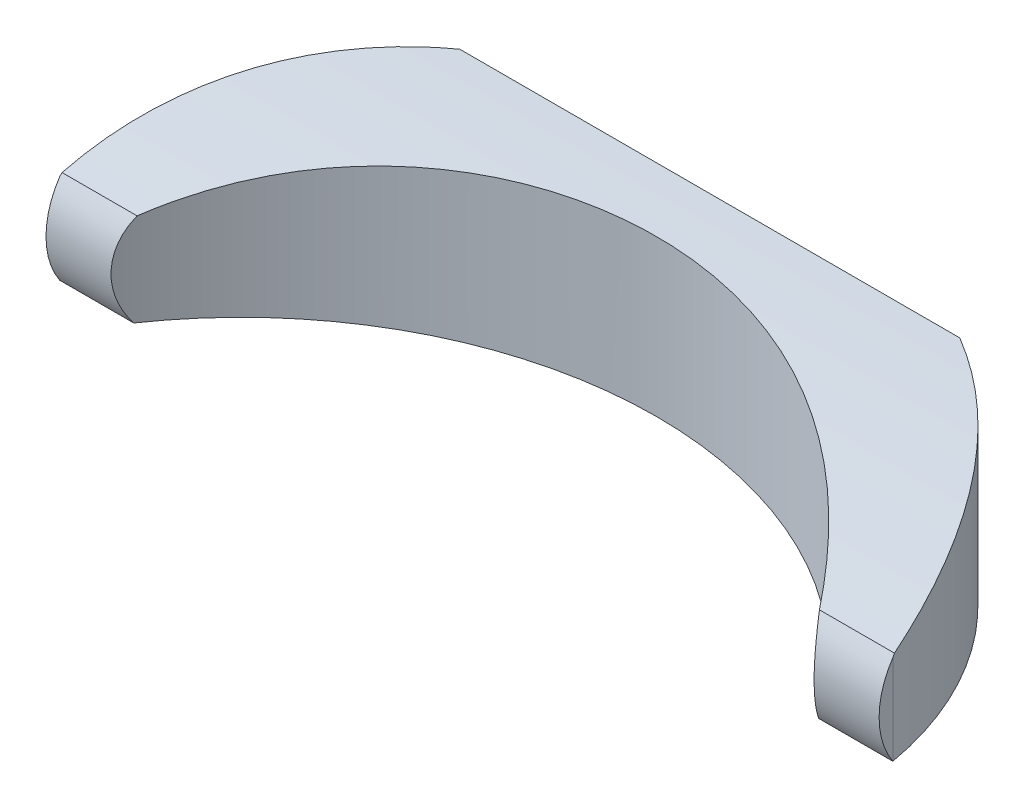
ISO-10303-21;
HEADER;
FILE_DESCRIPTION(('STEP AP214'),'2;1');
FILE_NAME('part.step','',(''),(''),'','','');
FILE_SCHEMA(('AUTOMOTIVE_DESIGN { 1 0 10303 214 1 1 1 1 }'));
ENDSEC;
DATA;
#1=APPLICATION_CONTEXT('core data for automotive mechanical design processes');
#2=APPLICATION_PROTOCOL_DEFINITION('international standard','automotive_design',2000,#1);
#3=PRODUCT_CONTEXT('',#1,'mechanical');
#4=PRODUCT('Part','Part','',(#3));
#5=PRODUCT_RELATED_PRODUCT_CATEGORY('part','',(#4));
#6=PRODUCT_DEFINITION_FORMATION('','',#4);
#7=PRODUCT_DEFINITION_CONTEXT('part definition',#1,'design');
#8=PRODUCT_DEFINITION('design','',#6,#7);
#9=PRODUCT_DEFINITION_SHAPE('','',#8);
#10=(LENGTH_UNIT() NAMED_UNIT(*) SI_UNIT(.MILLI.,.METRE.));
#11=(NAMED_UNIT(*) PLANE_ANGLE_UNIT() SI_UNIT($,.RADIAN.));
#12=(NAMED_UNIT(*) SI_UNIT($,.STERADIAN.) SOLID_ANGLE_UNIT());
#13=UNCERTAINTY_MEASURE_WITH_UNIT(LENGTH_MEASURE(1.E-05),#10,'distance_accuracy_value','');
#14=(GEOMETRIC_REPRESENTATION_CONTEXT(3) GLOBAL_UNCERTAINTY_ASSIGNED_CONTEXT((#13)) GLOBAL_UNIT_ASSIGNED_CONTEXT((#10,
#11,#12)) REPRESENTATION_CONTEXT('',''));
#15=CARTESIAN_POINT('',(0.,0.,0.));
#16=DIRECTION('',(0.,0.,1.));
#17=DIRECTION('',(1.,0.,0.));
#18=AXIS2_PLACEMENT_3D('',#15,#16,#17);
#19=CARTESIAN_POINT('',(386.358792184725,-406.025924914336,-173.707871951908));
#20=DIRECTION('',(-1.,0.,0.));
#21=DIRECTION('',(0.,0.,1.));
#22=AXIS2_PLACEMENT_3D('',#19,#20,#21);
#23=CYLINDRICAL_SURFACE('',#22,513.171988106752);
#24=CARTESIAN_POINT('',(-153.430774948807,55.5187782247357,50.6177315393173));
#25=CARTESIAN_POINT('',(-153.202685554566,56.1255648725674,49.369285670067));
#26=CARTESIAN_POINT('',(-152.962205663936,56.7263777072998,48.1202387606617));
#27=CARTESIAN_POINT('',(-152.45623692469,57.9159375243489,45.621451765565));
#28=CARTESIAN_POINT('',(-152.19074785455,58.5046843997328,44.3717116738312));
#29=CARTESIAN_POINT('',(-151.356424862871,60.2526462806282,40.6222192270144));
#30=CARTESIAN_POINT('',(-150.749740436409,61.3935684706254,38.122223661776));
#31=CARTESIAN_POINT('',(-149.433841216174,63.625818860735,33.1259238781543));
#32=CARTESIAN_POINT('',(-148.724587093074,64.7171278252159,30.6296214484789));
#33=CARTESIAN_POINT('',(-147.202623165766,66.848824241534,25.6468459372209));
#34=CARTESIAN_POINT('',(-146.389915432288,67.88921271202,23.1603726599245));
#35=CARTESIAN_POINT('',(-144.660470417526,69.9181965800934,18.2031850619156));
#36=CARTESIAN_POINT('',(-143.74375533913,70.9068029662032,15.7324674962666));
#37=CARTESIAN_POINT('',(-141.805767670981,72.8320365547571,10.8118341426195));
#38=CARTESIAN_POINT('',(-140.784494488364,73.7686634624216,8.36191847265735));
#39=CARTESIAN_POINT('',(-138.637577368679,75.5895981772944,3.48902836487891));
#40=CARTESIAN_POINT('',(-137.511950354785,76.4739144298083,1.06604962979815));
#41=CARTESIAN_POINT('',(-135.156598469928,78.19046227434,-3.74755550685225));
#42=CARTESIAN_POINT('',(-133.926873752021,79.022693942935,-6.13818195598368));
#43=CARTESIAN_POINT('',(-131.359970475643,80.6380331796544,-10.8889644273483));
#44=CARTESIAN_POINT('',(-130.022455071364,81.4209719696027,-13.2489958875063));
#45=CARTESIAN_POINT('',(-127.244706742592,82.9353630257782,-17.9247297481069));
#46=CARTESIAN_POINT('',(-125.804473584862,83.6668151750897,-20.2404320478784));
#47=CARTESIAN_POINT('',(-122.822763796423,85.0791715326357,-24.8219401937265));
#48=CARTESIAN_POINT('',(-121.281275442945,85.7600698685195,-27.0877402217015));
#49=CARTESIAN_POINT('',(-118.099248359522,87.0723275775556,-31.5634335219186));
#50=CARTESIAN_POINT('',(-116.458710068566,87.7036871702351,-33.7733270418767));
#51=CARTESIAN_POINT('',(-113.083062804686,88.9174594544886,-38.1289623793111));
#52=CARTESIAN_POINT('',(-111.348072730826,89.4999314413004,-40.2747798166903));
#53=CARTESIAN_POINT('',(-107.784403004586,90.6183425143344,-44.4997582956727));
#54=CARTESIAN_POINT('',(-105.955721933083,91.1542808953875,-46.5789183268503));
#55=CARTESIAN_POINT('',(-102.208130956909,92.1812346052886,-50.664983725556));
#56=CARTESIAN_POINT('',(-100.289240065002,92.6722593365148,-52.6719041623717));
#57=CARTESIAN_POINT('',(-96.3644130067902,93.6113523463592,-56.6088700325889));
#58=CARTESIAN_POINT('',(-94.3584818614818,94.0594230980441,-58.5389198880542));
#59=CARTESIAN_POINT('',(-89.3963995129003,95.0956175784906,-63.1172367247203));
#60=CARTESIAN_POINT('',(-86.3972843595752,95.6627917013153,-65.7238943270171));
#61=CARTESIAN_POINT('',(-80.241348704182,96.720276917279,-70.7595094454342));
#62=CARTESIAN_POINT('',(-77.0845580248454,97.2106024734969,-73.1885003528368));
#63=CARTESIAN_POINT('',(-72.2396274009154,97.8933088807836,-76.6908081014092));
#64=CARTESIAN_POINT('',(-70.6059390770932,98.1121286282471,-77.8349816914073));
#65=CARTESIAN_POINT('',(-67.3035219499349,98.532954397518,-80.0749439381422));
#66=CARTESIAN_POINT('',(-65.6347932163995,98.7349604528144,-81.1707326912486));
#67=CARTESIAN_POINT('',(-62.263659560825,99.1229745430345,-83.3128269774774));
#68=CARTESIAN_POINT('',(-60.5612488370298,99.3089797917691,-84.3591238784601));
#69=CARTESIAN_POINT('',(-57.1246536410795,99.6657354095095,-86.4009031251981));
#70=CARTESIAN_POINT('',(-55.3904691803689,99.8364857840099,-87.3963854892557));
#71=CARTESIAN_POINT('',(-53.6412078152752,99.9999999999999,-88.3658969804619));
#72=B_SPLINE_CURVE_WITH_KNOTS('',3,(#24,#25,#26,#27,#28,#29,#30,#31,#32,#33,#34,#35,#36,#37,#38,
#39,#40,#41,#42,#43,#44,#45,#46,#47,#48,#49,#50,#51,#52,#53,#54,#55,#56,#57,#58,#59,#60,#61,#62,
#63,#64,#65,#66,#67,#68,#69,#70,#71),.UNSPECIFIED.,.F.,.F.,(4,2,2,2,2,2,2,2,2,2,2,2,2,2,2,2,2,2,
2,2,2,2,2,4),(0.,4.21998996795097,8.44001731873224,16.8801698341858,25.3235672652203,
33.7667957196065,42.2082251416448,50.649702430777,59.0898131431199,67.5299114461289,
75.9974918188728,84.4650914191382,92.9336730851469,101.402217221147,109.860336875911,
118.318584682425,126.775057738179,135.231043621433,147.264589414661,159.295867740009,
165.31450647585,171.333133223636,177.352805870687,183.372476349559),.UNSPECIFIED.);
#73=CARTESIAN_POINT('',(-153.430774948807,55.5187782247358,50.6177315393173));
#74=VERTEX_POINT('',#73);
#75=CARTESIAN_POINT('',(-53.6412078152753,100.,-88.3658969804619));
#76=VERTEX_POINT('',#75);
#77=EDGE_CURVE('E97',#74,#76,#72,.T.);
#78=ORIENTED_EDGE('',*,*,#77,.F.);
#79=DIRECTION('',(-1.,0.,0.));
#80=VECTOR('',#79,1.);
#81=CARTESIAN_POINT('',(386.358792184725,55.5187782247358,50.6177315393171));
#82=LINE('',#81,#80);
#83=CARTESIAN_POINT('',(-108.415062663413,55.5187782247357,50.6177315393173));
#84=VERTEX_POINT('',#83);
#85=EDGE_CURVE('E212',#84,#74,#82,.T.);
#86=ORIENTED_EDGE('',*,*,#85,.F.);
#87=CARTESIAN_POINT('',(301.132647032862,55.5187782247357,50.6177315393172));
#88=CARTESIAN_POINT('',(300.25004037737,56.1364230717813,49.3469457138442));
#89=CARTESIAN_POINT('',(299.353563304733,56.7450060836648,48.0814462690729));
#90=CARTESIAN_POINT('',(297.532980361774,57.9441490026424,45.561839117888));
#91=CARTESIAN_POINT('',(296.608874556132,58.5347089519228,44.3077313848148));
#92=CARTESIAN_POINT('',(293.795343972477,60.2794670497049,40.563806041901));
#93=CARTESIAN_POINT('',(291.864641854095,61.4067883305128,38.0922937950352));
#94=CARTESIAN_POINT('',(287.895176833276,63.5904428631302,33.2054410249215));
#95=CARTESIAN_POINT('',(285.85641714102,64.6467782216819,30.7900988360337));
#96=CARTESIAN_POINT('',(282.719083986673,66.1788844129289,27.2144749701554));
#97=CARTESIAN_POINT('',(281.66009915672,66.6808572097037,26.0304899493625));
#98=CARTESIAN_POINT('',(279.51594472523,67.6675767097444,23.6790114174096));
#99=CARTESIAN_POINT('',(278.430773394816,68.1523222703865,22.5115190032307));
#100=CARTESIAN_POINT('',(275.140343872435,69.579324367237,19.0390918964945));
#101=CARTESIAN_POINT('',(272.896516902914,70.4961277473211,16.7600409145226));
#102=CARTESIAN_POINT('',(268.309271463792,72.2633810346303,12.2777009909077));
#103=CARTESIAN_POINT('',(265.965853068292,73.113830991224,10.0744119928964));
#104=CARTESIAN_POINT('',(262.378856569021,74.3411718480394,6.83098357458009));
#105=CARTESIAN_POINT('',(261.171183697389,74.7422386431835,5.76006717447063));
#106=CARTESIAN_POINT('',(258.732397775706,75.5285180669687,3.63948911787776));
#107=CARTESIAN_POINT('',(257.501286275154,75.9137317383544,2.58982606576279));
#108=CARTESIAN_POINT('',(253.773350419072,77.0460557444992,-0.526359696043427));
#109=CARTESIAN_POINT('',(251.241866362175,77.7698689930291,-2.5601317970322));
#110=CARTESIAN_POINT('',(246.088933430674,79.1581273427739,-6.5362138439067));
#111=CARTESIAN_POINT('',(243.467412058232,79.8225229727244,-8.47844694943889));
#112=CARTESIAN_POINT('',(238.140765632431,81.0937427647489,-12.2646724487174));
#113=CARTESIAN_POINT('',(235.435640523897,81.7005668888273,-14.1086647776272));
#114=CARTESIAN_POINT('',(229.946447795332,82.8591599495992,-17.6937305023137));
#115=CARTESIAN_POINT('',(227.16237782279,83.4109272434126,-19.4348008262954));
#116=CARTESIAN_POINT('',(221.520272516694,84.4619300678179,-22.8096373383866));
#117=CARTESIAN_POINT('',(218.662237183073,84.9611655983627,-24.4434035263998));
#118=CARTESIAN_POINT('',(212.877699745003,85.9095678428046,-27.5994357163907));
#119=CARTESIAN_POINT('',(209.951207869974,86.3587419802486,-29.121718238643));
#120=CARTESIAN_POINT('',(204.034542910386,87.2095938040948,-32.0514585618246));
#121=CARTESIAN_POINT('',(201.044369826688,87.61127149114,-33.4589163643082));
#122=CARTESIAN_POINT('',(195.005668590539,88.3695320852752,-36.15575965625));
#123=CARTESIAN_POINT('',(191.957140939257,88.7261153794513,-37.4451461591952));
#124=CARTESIAN_POINT('',(185.807088311742,89.3964811370589,-39.9029704459003));
#125=CARTESIAN_POINT('',(182.70556330534,89.7102635761244,-41.071408160805));
#126=CARTESIAN_POINT('',(176.446597989488,90.2979578449521,-43.2877400229648));
#127=CARTESIAN_POINT('',(173.289030220777,90.57176069185,-44.3353030999251));
#128=CARTESIAN_POINT('',(166.93163694778,91.0804802738031,-46.3040060432766));
#129=CARTESIAN_POINT('',(163.731811423783,91.3153969907192,-47.2251458506951));
#130=CARTESIAN_POINT('',(157.295481187651,91.7481348584425,-48.939061423774));
#131=CARTESIAN_POINT('',(154.05897640038,91.9459559332455,-49.7318369264319));
#132=CARTESIAN_POINT('',(147.554908220021,92.3060734136418,-51.187379923796));
#133=CARTESIAN_POINT('',(144.287344820798,92.4683698122171,-51.8501473928187));
#134=CARTESIAN_POINT('',(137.725437288214,92.7588332512365,-53.0445702628631));
#135=CARTESIAN_POINT('',(134.431082620495,92.8869861240901,-53.5761712306249));
#136=CARTESIAN_POINT('',(127.822593957095,93.1101595879747,-54.506833563237));
#137=CARTESIAN_POINT('',(124.508459975963,93.2051802033745,-54.9058950255703));
#138=CARTESIAN_POINT('',(117.866048622744,93.3629130648536,-55.5706863082535));
#139=CARTESIAN_POINT('',(114.537771114826,93.425624999937,-55.836414845171));
#140=CARTESIAN_POINT('',(107.872778361057,93.5192909096579,-56.2340092534096));
#141=CARTESIAN_POINT('',(104.536063087914,93.550244781444,-56.3658746912028));
#142=CARTESIAN_POINT('',(97.7989998911666,93.5809470663964,-56.4966625768933));
#143=CARTESIAN_POINT('',(94.3986011436295,93.5801161504794,-56.4931169411787));
#144=CARTESIAN_POINT('',(87.6009505150742,93.5458054295203,-56.3469704410206));
#145=CARTESIAN_POINT('',(84.2036986446189,93.5123255152826,-56.2043691115008));
#146=CARTESIAN_POINT('',(77.4183044162891,93.4124076850456,-55.7803996206817));
#147=CARTESIAN_POINT('',(74.0301621773709,93.3459693407467,-55.4990296560638));
#148=CARTESIAN_POINT('',(67.2690319204153,93.1795290173711,-54.7981000522697));
#149=CARTESIAN_POINT('',(63.896043888363,93.0795270693411,-54.3785405409202));
#150=CARTESIAN_POINT('',(57.1723407496341,92.8451026538612,-53.4022648187474));
#151=CARTESIAN_POINT('',(53.8216185115722,92.7106918121013,-52.845594935635));
#152=CARTESIAN_POINT('',(47.147266100852,92.4062568451569,-51.5961897958577));
#153=CARTESIAN_POINT('',(43.8236359292894,92.236232718532,-50.9034545336894));
#154=CARTESIAN_POINT('',(37.2094321702511,91.8591276211996,-49.3833894333631));
#155=CARTESIAN_POINT('',(33.918858438555,91.6520468122393,-48.5560601826898));
#156=CARTESIAN_POINT('',(27.3766771369426,91.1991318203264,-46.7685861623156));
#157=CARTESIAN_POINT('',(24.1250695788605,90.9532976256045,-45.8084413522789));
#158=CARTESIAN_POINT('',(17.6608945445591,90.4204684993399,-43.7555950137077));
#159=CARTESIAN_POINT('',(14.4484079347614,90.1334002280985,-42.6626578436951));
#160=CARTESIAN_POINT('',(8.07433250125635,89.5162877586095,-40.3480607592386));
#161=CARTESIAN_POINT('',(4.9127436821143,89.1862435565073,-39.1264008332491));
#162=CARTESIAN_POINT('',(-1.35373557997023,88.4808462160647,-36.5571622246158));
#163=CARTESIAN_POINT('',(-4.45862569181005,88.1054928132301,-35.2095828069225));
#164=CARTESIAN_POINT('',(-10.605946520499,87.3069956398752,-32.3916901853954));
#165=CARTESIAN_POINT('',(-13.6483772036497,86.8838518435716,-30.9213769153458));
#166=CARTESIAN_POINT('',(-19.6657341610779,85.987083801636,-27.8612708887032));
#167=CARTESIAN_POINT('',(-22.6406468068101,85.5134494724719,-26.2714542847035));
#168=CARTESIAN_POINT('',(-28.5167993001636,84.5130910455925,-22.9765637940022));
#169=CARTESIAN_POINT('',(-31.4180393523441,83.9863670953059,-21.2714902273708));
#170=CARTESIAN_POINT('',(-37.1414875194037,82.8771058465269,-17.7504334479485));
#171=CARTESIAN_POINT('',(-39.9636957523426,82.2945686314154,-15.9344504008499));
#172=CARTESIAN_POINT('',(-45.5238776391817,81.0709737455527,-12.1963604220291));
#173=CARTESIAN_POINT('',(-48.261850435394,80.4299154792018,-10.2742524102958));
#174=CARTESIAN_POINT('',(-53.7947346121649,79.0501606254122,-6.22203441268428));
#175=CARTESIAN_POINT('',(-56.5846876204797,78.3080550909405,-4.08629718311042));
#176=CARTESIAN_POINT('',(-60.6908986933678,77.1417191042779,-0.803662123276887));
#177=CARTESIAN_POINT('',(-62.0465423994411,76.7440689787752,0.3037441214462));
#178=CARTESIAN_POINT('',(-64.7311384169528,75.9306331615721,2.54418042427833));
#179=CARTESIAN_POINT('',(-66.0600886946271,75.5148460956209,3.67721242092875));
#180=CARTESIAN_POINT('',(-70.0058999802679,74.2397602634045,7.11339513553573));
#181=CARTESIAN_POINT('',(-72.5817356511174,73.3527328375905,9.4536439458694));
#182=CARTESIAN_POINT('',(-77.6189673244164,71.502246869972,14.225313132092));
#183=CARTESIAN_POINT('',(-80.08036322804,70.5387882621665,16.6567335867099));
#184=CARTESIAN_POINT('',(-83.6864334830902,69.0333740664801,20.3692824163486));
#185=CARTESIAN_POINT('',(-84.8756088331832,68.5208262035228,21.6193689903895));
#186=CARTESIAN_POINT('',(-87.2236169549245,67.475748636506,24.139329297733));
#187=CARTESIAN_POINT('',(-88.3824520565779,66.9432204745375,25.409201499564));
#188=CARTESIAN_POINT('',(-91.8129932513978,65.315210198684,29.2471638025253));
#189=CARTESIAN_POINT('',(-94.0387734672879,64.1892863612823,31.8436389994081));
#190=CARTESIAN_POINT('',(-98.3645644022352,61.8548005429417,37.1034048131603));
#191=CARTESIAN_POINT('',(-100.464573084234,60.6462372242116,39.7666965112319));
#192=CARTESIAN_POINT('',(-103.518366330839,58.7706853209599,43.8048961399936));
#193=CARTESIAN_POINT('',(-104.520280811583,58.1350361932144,45.1582019008723));
#194=CARTESIAN_POINT('',(-106.491880154462,56.8427102961888,47.8781912773073));
#195=CARTESIAN_POINT('',(-107.461564936248,56.186033474495,49.2448749262034));
#196=CARTESIAN_POINT('',(-108.415062663413,55.5187782247358,50.6177315393174));
#197=B_SPLINE_CURVE_WITH_KNOTS('',3,(#87,#88,#89,#90,#91,#92,#93,#94,#95,#96,#97,#98,#99,#100,
#101,#102,#103,#104,#105,#106,#107,#108,#109,#110,#111,#112,#113,#114,#115,#116,#117,#118,#119,
#120,#121,#122,#123,#124,#125,#126,#127,#128,#129,#130,#131,#132,#133,#134,#135,#136,#137,#138,
#139,#140,#141,#142,#143,#144,#145,#146,#147,#148,#149,#150,#151,#152,#153,#154,#155,#156,#157,
#158,#159,#160,#161,#162,#163,#164,#165,#166,#167,#168,#169,#170,#171,#172,#173,#174,#175,#176,
#177,#178,#179,#180,#181,#182,#183,#184,#185,#186,#187,#188,#189,#190,#191,#192,#193,#194,#195,
#196),.UNSPECIFIED.,.F.,.F.,(4,2,2,2,2,2,2,2,2,2,2,2,2,2,2,2,2,2,2,2,2,2,2,2,2,2,2,2,2,2,2,2,2,
2,2,2,2,2,2,2,2,2,2,2,2,2,2,2,2,2,2,2,2,2,4),(0.,4.99765866470778,9.99530563058099,
19.9902362773736,29.9848701603894,34.9822614853508,39.9799836539564,49.9579808065253,
59.9359705351249,64.9251998667807,69.9141005039895,79.8916584861124,89.8774479366759,
99.8632439775331,109.849337902665,119.835431836748,129.820042968536,139.804653965158,
149.789179248979,159.773710216883,169.784969912399,179.796234277845,189.807519154858,
199.818806009623,209.834240523027,219.84966767004,229.865191221416,239.880747208863,
250.078938381155,260.277163661741,270.47552147323,280.673869851158,290.868777063075,
301.063684687349,311.258547813415,321.453414035643,331.66664288252,341.879872645453,
352.093162031382,362.306456927488,372.521795369277,382.737105444081,392.952400258178,
403.167799050323,413.936926334075,419.321706157604,424.706894701467,435.477215930584,
446.24754646037,451.646763129609,457.045563937947,467.842994224899,478.640599345099,
484.039628648024,489.438671409636),.UNSPECIFIED.);
#198=CARTESIAN_POINT('',(301.132647032862,55.5187782247358,50.6177315393171));
#199=VERTEX_POINT('',#198);
#200=EDGE_CURVE('E105',#199,#84,#197,.T.);
#201=ORIENTED_EDGE('',*,*,#200,.F.);
#202=CARTESIAN_POINT('',(346.148359318256,55.5187782247358,50.6177315393171));
#203=VERTEX_POINT('',#202);
#204=EDGE_CURVE('E208',#203,#199,#82,.T.);
#205=ORIENTED_EDGE('',*,*,#204,.F.);
#206=CARTESIAN_POINT('',(246.358792184724,100.,-88.3658969804621));
#207=CARTESIAN_POINT('',(247.548318325603,99.888808302316,-87.7066040307549));
#208=CARTESIAN_POINT('',(248.730844277845,99.7742727742954,-87.0353289088595));
#209=CARTESIAN_POINT('',(251.08144805404,99.5382624647899,-85.6691156286501));
#210=CARTESIAN_POINT('',(252.249525858487,99.4167876739374,-84.9741774383928));
#211=CARTESIAN_POINT('',(255.731304173482,99.0415889522897,-82.8543877617912));
#212=CARTESIAN_POINT('',(258.022658777122,98.7770805194625,-81.3945006405534));
#213=CARTESIAN_POINT('',(262.541436917173,98.2173486164032,-78.3844547127211));
#214=CARTESIAN_POINT('',(264.768858385172,97.9221241538493,-76.8342929903994));
#215=CARTESIAN_POINT('',(269.155843722992,97.2989571000559,-73.6469444954052));
#216=CARTESIAN_POINT('',(271.315407939334,96.9710146759302,-72.0097581672489));
#217=CARTESIAN_POINT('',(275.557064704732,96.2813633145253,-68.6564583819677));
#218=CARTESIAN_POINT('',(277.639352742355,95.9197490504715,-66.9405727126554));
#219=CARTESIAN_POINT('',(281.729043657991,95.1600569292082,-63.4294648872407));
#220=CARTESIAN_POINT('',(283.736446677323,94.7619791408151,-61.6342428808704));
#221=CARTESIAN_POINT('',(287.672828069789,93.9275002093787,-57.9685304021089));
#222=CARTESIAN_POINT('',(289.601810828351,93.4911012136632,-56.0980441503256));
#223=CARTESIAN_POINT('',(293.378242553991,92.5781650089909,-52.2859127413774));
#224=CARTESIAN_POINT('',(295.225691557967,92.1016278181991,-50.3442676164163));
#225=CARTESIAN_POINT('',(298.83880723818,91.1059732496889,-46.3912359014614));
#226=CARTESIAN_POINT('',(300.604345034498,90.586792108762,-44.3797475695482));
#227=CARTESIAN_POINT('',(304.047870871747,89.5049259786283,-40.2944918997129));
#228=CARTESIAN_POINT('',(305.725858829637,88.9422409481591,-38.2207245027217));
#229=CARTESIAN_POINT('',(308.991893220003,87.7719418546128,-34.015641132814));
#230=CARTESIAN_POINT('',(310.579934598561,87.1643252713363,-31.8843219360945));
#231=CARTESIAN_POINT('',(313.663789151322,85.902981171598,-27.5692622028191));
#232=CARTESIAN_POINT('',(315.159602555419,85.2492537700849,-25.3855217969518));
#233=CARTESIAN_POINT('',(318.05741574745,83.8945489760429,-20.970346204743));
#234=CARTESIAN_POINT('',(319.459398008934,83.1935628049959,-18.7389022101185));
#235=CARTESIAN_POINT('',(322.167735427978,81.7436427381565,-14.2339324185571));
#236=CARTESIAN_POINT('',(323.47408972452,80.9947084107607,-11.9604062429502));
#237=CARTESIAN_POINT('',(325.989803302017,79.4484371849648,-7.37693028666893));
#238=CARTESIAN_POINT('',(327.199176384727,78.6511072024058,-5.06698574501612));
#239=CARTESIAN_POINT('',(329.520298415295,77.0076153175741,-0.41571548167607));
#240=CARTESIAN_POINT('',(330.632050688069,76.1614550800632,1.92560916808727));
#241=CARTESIAN_POINT('',(332.548882256125,74.5911054653226,6.17217293610911));
#242=CARTESIAN_POINT('',(333.371324273697,73.8755744555699,8.07280594359935));
#243=CARTESIAN_POINT('',(334.952875741651,72.4128908540497,11.8883654458029));
#244=CARTESIAN_POINT('',(335.711981546105,71.6657364456175,13.8032927564602));
#245=CARTESIAN_POINT('',(337.166795787763,70.1400730947791,17.644425780843));
#246=CARTESIAN_POINT('',(337.862510920106,69.3615674761489,19.5706302805819));
#247=CARTESIAN_POINT('',(339.190859350778,67.773351703284,23.4319079819217));
#248=CARTESIAN_POINT('',(339.823492422176,66.9636414368083,25.3669812154006));
#249=CARTESIAN_POINT('',(341.025544620689,65.3139950256683,29.2418746676746));
#250=CARTESIAN_POINT('',(341.595014011926,64.474083629511,31.1816898380912));
#251=CARTESIAN_POINT('',(342.671807525821,62.7638110953089,35.0651501188843));
#252=CARTESIAN_POINT('',(343.17913122705,61.8934497508241,37.0087952551421));
#253=CARTESIAN_POINT('',(344.132189521093,60.1228084810756,40.8973707094269));
#254=CARTESIAN_POINT('',(344.577928411805,59.2225306490767,42.8423009282419));
#255=CARTESIAN_POINT('',(345.408577267431,57.3925737269235,46.7312521509252));
#256=CARTESIAN_POINT('',(345.793489008619,56.4628954962714,48.6752731796901));
#257=CARTESIAN_POINT('',(346.148359318256,55.5187782247357,50.6177315393172));
#258=B_SPLINE_CURVE_WITH_KNOTS('',3,(#206,#207,#208,#209,#210,#211,#212,#213,#214,#215,#216,
#217,#218,#219,#220,#221,#222,#223,#224,#225,#226,#227,#228,#229,#230,#231,#232,#233,#234,#235,
#236,#237,#238,#239,#240,#241,#242,#243,#244,#245,#246,#247,#248,#249,#250,#251,#252,#253,#254,
#255,#256,#257),.UNSPECIFIED.,.F.,.F.,(4,2,2,2,2,2,2,2,2,2,2,2,2,2,2,2,2,2,2,2,2,2,2,2,2,4),(0.,
4.09350101037931,8.18700754686939,16.373645144225,24.5605473038651,32.7474076493403,
40.9119071545898,49.0763912515733,57.2404181434951,65.4044413407265,73.5809021020496,
81.7573706186479,89.9342980996702,98.111205197345,106.289635397814,114.468139226443,
122.645477068729,130.82253628687,137.394611060508,143.967063892961,150.538821755574,
157.110603258553,163.677116997926,170.24367526459,176.809775030864,183.375683018453),.UNSPECIFIED.);
#259=CARTESIAN_POINT('',(246.358792184725,100.,-88.3658969804619));
#260=VERTEX_POINT('',#259);
#261=EDGE_CURVE('E120',#260,#203,#258,.T.);
#262=ORIENTED_EDGE('',*,*,#261,.F.);
#263=DIRECTION('',(-1.,0.,0.));
#264=VECTOR('',#263,1.);
#265=CARTESIAN_POINT('',(-153.641207815275,100.,-88.3658969804619));
#266=LINE('',#265,#264);
#267=EDGE_CURVE('E112',#260,#76,#266,.T.);
#268=ORIENTED_EDGE('',*,*,#267,.T.);
#269=EDGE_LOOP('',(#78,#86,#201,#205,#262,#268));
#270=FACE_BOUND('',#269,.T.);
#271=ADVANCED_FACE('F40',(#270),#23,.T.);
#272=CARTESIAN_POINT('',(386.358792184725,26.930002729708,11.8981771195857));
#273=DIRECTION('',(-1.,0.,0.));
#274=DIRECTION('',(0.,0.,1.));
#275=AXIS2_PLACEMENT_3D('',#272,#273,#274);
#276=CYLINDRICAL_SURFACE('',#275,48.1302605308515);
#277=CARTESIAN_POINT('',(-153.641207815275,53.8600054594162,51.7892404263662));
#278=CARTESIAN_POINT('',(-153.607765540296,54.140725110277,51.5997245274685));
#279=CARTESIAN_POINT('',(-153.573508330601,54.4193159994846,51.4073408374318));
#280=CARTESIAN_POINT('',(-153.503364041778,54.9722402545911,51.0168378750821));
#281=CARTESIAN_POINT('',(-153.467476962651,55.24657362049,50.8187186027692));
#282=CARTESIAN_POINT('',(-153.430774948807,55.5187782247358,50.6177315393173));
#283=B_SPLINE_CURVE_WITH_KNOTS('',3,(#277,#278,#279,#280,#281,#282),.UNSPECIFIED.,.F.,.F.,(4,2,
4),(0.,1.02087282137399,2.04174564273778),.UNSPECIFIED.);
#284=CARTESIAN_POINT('',(-153.641207815275,53.8600054594159,51.7892404263663));
#285=VERTEX_POINT('',#284);
#286=EDGE_CURVE('E100',#285,#74,#283,.T.);
#287=ORIENTED_EDGE('',*,*,#286,.F.);
#288=CARTESIAN_POINT('',(-153.641207815275,26.930002729708,11.8981771195859));
#289=DIRECTION('',(1.,0.,0.));
#290=DIRECTION('',(0.,0.,1.));
#291=AXIS2_PLACEMENT_3D('',#288,#289,#290);
#292=CIRCLE('',#291,48.1302605308515);
#293=CARTESIAN_POINT('',(-153.641207815275,0.,51.7892404263663));
#294=VERTEX_POINT('',#293);
#295=EDGE_CURVE('E213',#285,#294,#292,.T.);
#296=ORIENTED_EDGE('',*,*,#295,.T.);
#297=DIRECTION('',(-1.,0.,0.));
#298=VECTOR('',#297,1.);
#299=CARTESIAN_POINT('',(386.358792184725,0.,51.7892404263661));
#300=LINE('',#299,#298);
#301=CARTESIAN_POINT('',(-109.223772427222,0.,51.7892404263663));
#302=VERTEX_POINT('',#301);
#303=EDGE_CURVE('E121',#302,#294,#300,.T.);
#304=ORIENTED_EDGE('',*,*,#303,.F.);
#305=CARTESIAN_POINT('',(-108.415062663413,55.5187782247358,50.6177315393173));
#306=CARTESIAN_POINT('',(-108.64777705172,55.064995745753,50.9527934298098));
#307=CARTESIAN_POINT('',(-108.874710073315,54.6033854172542,51.2812896558245));
#308=CARTESIAN_POINT('',(-109.316725656683,53.6649385330186,51.9242755984898));
#309=CARTESIAN_POINT('',(-109.531807454065,53.1881009982674,52.2387644114253));
#310=CARTESIAN_POINT('',(-109.949895288589,52.2194734827237,52.8529528141679));
#311=CARTESIAN_POINT('',(-110.152895939681,51.7276769783526,53.1526457976578));
#312=CARTESIAN_POINT('',(-110.546411350049,50.7299493386827,53.73618199986));
#313=CARTESIAN_POINT('',(-110.736926342995,50.2240184681618,54.020025515181));
#314=CARTESIAN_POINT('',(-111.290084551341,48.6837944976185,54.8476130209506));
#315=CARTESIAN_POINT('',(-111.633570503477,47.6288542089452,55.3662787189392));
#316=CARTESIAN_POINT('',(-112.267182372609,45.4706430875825,56.3297353338676));
#317=CARTESIAN_POINT('',(-112.557316653313,44.3673798639023,56.7745378289573));
#318=CARTESIAN_POINT('',(-113.083410506584,42.1157096419149,57.5857292793849));
#319=CARTESIAN_POINT('',(-113.319199533216,40.9671734260911,57.9518711448114));
#320=CARTESIAN_POINT('',(-113.733985638048,38.6361935406287,58.5988212860591));
#321=CARTESIAN_POINT('',(-113.912979385246,37.4537478866586,58.8796245567917));
#322=CARTESIAN_POINT('',(-114.212832972134,35.0655902182133,59.3514543520321));
#323=CARTESIAN_POINT('',(-114.333775648788,33.8599139256857,59.5426087934773));
#324=CARTESIAN_POINT('',(-114.517147955423,31.4331644553202,59.8328893980275));
#325=CARTESIAN_POINT('',(-114.579581087426,30.2120922034239,59.932021069046));
#326=CARTESIAN_POINT('',(-114.643956407464,27.8239019906659,60.0342481964138));
#327=CARTESIAN_POINT('',(-114.64869113275,26.657046143912,60.0417770930887));
#328=CARTESIAN_POINT('',(-114.604837844692,24.3268853225053,59.9721229132777));
#329=CARTESIAN_POINT('',(-114.556251067416,23.1635802661669,59.8949418004919));
#330=CARTESIAN_POINT('',(-114.405984584883,20.8483475764986,59.6568471819958));
#331=CARTESIAN_POINT('',(-114.304273231162,19.6964271427138,59.4958837639651));
#332=CARTESIAN_POINT('',(-114.048315328856,17.4129458167313,59.092370054879));
#333=CARTESIAN_POINT('',(-113.894070164425,16.2813843889443,58.8498219134081));
#334=CARTESIAN_POINT('',(-113.536224040361,14.0607218323216,58.2899656543786));
#335=CARTESIAN_POINT('',(-113.333280875643,12.971262412227,57.9736553720255));
#336=CARTESIAN_POINT('',(-112.878125108888,10.826527053191,57.2685904348307));
#337=CARTESIAN_POINT('',(-112.625907651364,9.77125449498005,56.8798286407908));
#338=CARTESIAN_POINT('',(-112.073905686419,7.70238358959487,56.0350993382112));
#339=CARTESIAN_POINT('',(-111.774175262016,6.68873948971918,55.5792082829575));
#340=CARTESIAN_POINT('',(-111.128618968042,4.70748916008841,54.6053139804355));
#341=CARTESIAN_POINT('',(-110.782812314902,3.73986396486379,54.0873366357076));
#342=CARTESIAN_POINT('',(-110.227527183223,2.31751468630093,53.2630830184196));
#343=CARTESIAN_POINT('',(-110.034417170081,1.84409923146143,52.9776457061036));
#344=CARTESIAN_POINT('',(-109.637280472648,0.911503475344781,52.3933855804999));
#345=CARTESIAN_POINT('',(-109.43327218966,0.452301125242344,52.0945854605791));
#346=CARTESIAN_POINT('',(-109.223772427221,0.,51.7892404263662));
#347=B_SPLINE_CURVE_WITH_KNOTS('',3,(#305,#306,#307,#308,#309,#310,#311,#312,#313,#314,#315,
#316,#317,#318,#319,#320,#321,#322,#323,#324,#325,#326,#327,#328,#329,#330,#331,#332,#333,#334,
#335,#336,#337,#338,#339,#340,#341,#342,#343,#344,#345,#346),.UNSPECIFIED.,.F.,.F.,(4,2,2,2,2,2,
2,2,2,2,2,2,2,2,2,2,2,2,2,2,4),(0.,1.83049374795301,3.66110542314236,5.49252720560035,
7.3239147031341,10.9934218391518,14.6623532312382,18.3426462595164,22.023155094484,
25.6983962347612,29.3734173836643,32.8698229201848,36.3661474067002,39.8645571752936,
43.3628747754256,46.8163634300824,50.2701925633237,53.7201181382007,57.1686093735852,
58.9249407281663,60.6783949574517),.UNSPECIFIED.);
#348=EDGE_CURVE('E140',#84,#302,#347,.T.);
#349=ORIENTED_EDGE('',*,*,#348,.F.);
#350=ORIENTED_EDGE('',*,*,#85,.T.);
#351=EDGE_LOOP('',(#287,#296,#304,#349,#350));
#352=FACE_BOUND('',#351,.T.);
#353=ADVANCED_FACE('F145',(#352),#276,.T.);
#354=CARTESIAN_POINT('',(346.148359318256,55.5187782247358,50.6177315393171));
#355=CARTESIAN_POINT('',(346.1850613321,55.24657362049,50.818718602769));
#356=CARTESIAN_POINT('',(346.220948411227,54.9722402545911,51.0168378750819));
#357=CARTESIAN_POINT('',(346.29109270005,54.4193159994846,51.4073408374316));
#358=CARTESIAN_POINT('',(346.325349909746,54.1407251102769,51.5997245274684));
#359=CARTESIAN_POINT('',(346.358792184725,53.8600054594162,51.789240426366));
#360=B_SPLINE_CURVE_WITH_KNOTS('',3,(#354,#355,#356,#357,#358,#359),.UNSPECIFIED.,.F.,.F.,(4,2,
4),(0.,1.02087282136382,2.04174564273784),.UNSPECIFIED.);
#361=CARTESIAN_POINT('',(346.358792184725,53.8600054594163,51.7892404263661));
#362=VERTEX_POINT('',#361);
#363=EDGE_CURVE('E182',#203,#362,#360,.T.);
#364=ORIENTED_EDGE('',*,*,#363,.F.);
#365=ORIENTED_EDGE('',*,*,#204,.T.);
#366=CARTESIAN_POINT('',(301.941356796671,0.,51.7892404263661));
#367=CARTESIAN_POINT('',(302.157440684363,0.466503784210932,52.1041813915733));
#368=CARTESIAN_POINT('',(302.36769823476,0.940403907297029,52.4121832949457));
#369=CARTESIAN_POINT('',(302.776294978213,1.90250209326222,53.0134762080525));
#370=CARTESIAN_POINT('',(302.974633458242,2.39070100893571,53.3067663375206));
#371=CARTESIAN_POINT('',(303.35917689624,3.38104294730608,53.8778785707908));
#372=CARTESIAN_POINT('',(303.545376999841,3.8831914355981,54.1556944797677));
#373=CARTESIAN_POINT('',(303.905278492703,4.90056981566824,54.6948784857719));
#374=CARTESIAN_POINT('',(304.078980102073,5.4157994768611,54.9562468724419));
#375=CARTESIAN_POINT('',(304.581504254373,6.9818399525188,55.7152878969655));
#376=CARTESIAN_POINT('',(304.891203882242,8.05160615496093,56.1870886341492));
#377=CARTESIAN_POINT('',(305.457574076306,10.2345873754989,57.0552930172385));
#378=CARTESIAN_POINT('',(305.71425232649,11.3477960699615,57.4517075876311));
#379=CARTESIAN_POINT('',(306.173817778571,13.6139205968008,58.1649974981318));
#380=CARTESIAN_POINT('',(306.376550284715,14.7669401334931,58.481643958371));
#381=CARTESIAN_POINT('',(306.726030430339,17.1015126521814,59.0294878032098));
#382=CARTESIAN_POINT('',(306.872775015454,18.2830671871377,59.2606805259453));
#383=CARTESIAN_POINT('',(307.109225535841,20.6642497739663,59.6340419393567));
#384=CARTESIAN_POINT('',(307.199004123411,21.8638527993435,59.7763240198023));
#385=CARTESIAN_POINT('',(307.321268915415,24.2732285662434,59.9702483458824));
#386=CARTESIAN_POINT('',(307.35375807958,25.4830007791531,60.0218952739791));
#387=CARTESIAN_POINT('',(307.361101518406,27.8522771921062,60.0335631829822));
#388=CARTESIAN_POINT('',(307.338319899292,29.0117579071681,59.9973425436015));
#389=CARTESIAN_POINT('',(307.240139013654,31.3228448366576,59.8415413638288));
#390=CARTESIAN_POINT('',(307.164740793033,32.4744512071506,59.7219624804192));
#391=CARTESIAN_POINT('',(306.961690594611,34.762171704929,59.4009568971052));
#392=CARTESIAN_POINT('',(306.834009498634,35.8982768341021,59.1994845883292));
#393=CARTESIAN_POINT('',(306.527105837084,38.1464162704065,58.7173578547427));
#394=CARTESIAN_POINT('',(306.347884283374,39.2584510496363,58.4367049844411));
#395=CARTESIAN_POINT('',(305.9397540723,41.4464936469853,57.8011830730016));
#396=CARTESIAN_POINT('',(305.711057210853,42.522633135259,57.4466306136329));
#397=CARTESIAN_POINT('',(305.204761610029,44.6372695756294,56.6669687015776));
#398=CARTESIAN_POINT('',(304.927158078555,45.6757628269428,56.2418523349555));
#399=CARTESIAN_POINT('',(304.324868134556,47.7081680430597,55.3266343608337));
#400=CARTESIAN_POINT('',(304.000227551559,48.7021221833566,54.8365960479635));
#401=CARTESIAN_POINT('',(303.305470577284,50.6413051700216,53.7969331102669));
#402=CARTESIAN_POINT('',(302.935371896383,51.586552789882,53.2473317008513));
#403=CARTESIAN_POINT('',(302.32185605227,53.0252815912304,52.3448734689625));
#404=CARTESIAN_POINT('',(302.093225024535,53.5366809483905,52.0102303334446));
#405=CARTESIAN_POINT('',(301.622796643618,54.541248889104,51.3254512369982));
#406=CARTESIAN_POINT('',(301.381023475907,55.0344483324797,50.9753439434381));
#407=CARTESIAN_POINT('',(301.132647032862,55.5187782247358,50.6177315393171));
#408=B_SPLINE_CURVE_WITH_KNOTS('',3,(#366,#367,#368,#369,#370,#371,#372,#373,#374,#375,#376,
#377,#378,#379,#380,#381,#382,#383,#384,#385,#386,#387,#388,#389,#390,#391,#392,#393,#394,#395,
#396,#397,#398,#399,#400,#401,#402,#403,#404,#405,#406,#407),.UNSPECIFIED.,.F.,.F.,(4,2,2,2,2,2,
2,2,2,2,2,2,2,2,2,2,2,2,2,2,4),(0.,1.8086423875075,3.61739286480842,5.42686231389589,
7.2362998891054,10.8602647504764,14.4837040488968,18.117424661763,21.7513434802661,
25.3806183699456,29.0097057557409,32.4863217827027,35.96286870399,39.4413544757939,
42.9197719611343,46.3835835847006,49.8477347972,53.3085332076053,56.7679875499355,
58.725050522197,60.6786264203902),.UNSPECIFIED.);
#409=CARTESIAN_POINT('',(301.941356796671,0.,51.7892404263661));
#410=VERTEX_POINT('',#409);
#411=EDGE_CURVE('E132',#410,#199,#408,.T.);
#412=ORIENTED_EDGE('',*,*,#411,.F.);
#413=CARTESIAN_POINT('',(346.358792184725,0.,51.7892404263661));
#414=VERTEX_POINT('',#413);
#415=EDGE_CURVE('E124',#414,#410,#300,.T.);
#416=ORIENTED_EDGE('',*,*,#415,.F.);
#417=CARTESIAN_POINT('',(346.358792184725,26.930002729708,11.8981771195857));
#418=DIRECTION('',(-1.,0.,0.));
#419=DIRECTION('',(0.,0.,1.));
#420=AXIS2_PLACEMENT_3D('',#417,#418,#419);
#421=CIRCLE('',#420,48.1302605308515);
#422=EDGE_CURVE('E126',#362,#414,#421,.F.);
#423=ORIENTED_EDGE('',*,*,#422,.F.);
#424=EDGE_LOOP('',(#364,#365,#412,#416,#423));
#425=FACE_BOUND('',#424,.T.);
#426=ADVANCED_FACE('F207',(#425),#276,.T.);
#427=CARTESIAN_POINT('',(-153.641207815275,100.,-88.3658969804619));
#428=DIRECTION('',(1.,0.,0.));
#429=DIRECTION('',(0.,0.,-1.));
#430=AXIS2_PLACEMENT_3D('',#427,#428,#429);
#431=PLANE('',#430);
#432=DIRECTION('',(0.,1.,0.));
#433=VECTOR('',#432,1.);
#434=CARTESIAN_POINT('',(-153.641207815275,-460.,51.7892404263663));
#435=LINE('',#434,#433);
#436=EDGE_CURVE('E115',#294,#285,#435,.T.);
#437=ORIENTED_EDGE('',*,*,#436,.F.);
#438=ORIENTED_EDGE('',*,*,#295,.F.);
#439=EDGE_LOOP('',(#437,#438));
#440=FACE_BOUND('',#439,.T.);
#441=ADVANCED_FACE('F42',(#440),#431,.F.);
#442=CARTESIAN_POINT('',(346.358792184725,100.,-88.3658969804619));
#443=DIRECTION('',(-1.,0.,0.));
#444=DIRECTION('',(0.,0.,1.));
#445=AXIS2_PLACEMENT_3D('',#442,#443,#444);
#446=PLANE('',#445);
#447=DIRECTION('',(0.,1.,0.));
#448=VECTOR('',#447,1.);
#449=CARTESIAN_POINT('',(346.358792184725,-460.,51.7892404263661));
#450=LINE('',#449,#448);
#451=EDGE_CURVE('E116',#414,#362,#450,.T.);
#452=ORIENTED_EDGE('',*,*,#451,.T.);
#453=ORIENTED_EDGE('',*,*,#422,.T.);
#454=EDGE_LOOP('',(#452,#453));
#455=FACE_BOUND('',#454,.T.);
#456=ADVANCED_FACE('F226',(#455),#446,.F.);
#457=CARTESIAN_POINT('',(-153.641207815275,100.,-88.3658969804619));
#458=DIRECTION('',(0.,0.,1.));
#459=DIRECTION('',(1.,0.,0.));
#460=AXIS2_PLACEMENT_3D('',#457,#458,#459);
#461=PLANE('',#460);
#462=DIRECTION('',(0.,1.,0.));
#463=VECTOR('',#462,1.);
#464=CARTESIAN_POINT('',(-53.6412078152753,-460.,-88.3658969804619));
#465=LINE('',#464,#463);
#466=CARTESIAN_POINT('',(-53.6412078152753,0.,-88.3658969804619));
#467=VERTEX_POINT('',#466);
#468=EDGE_CURVE('E54',#467,#76,#465,.T.);
#469=ORIENTED_EDGE('',*,*,#468,.T.);
#470=ORIENTED_EDGE('',*,*,#267,.F.);
#471=DIRECTION('',(0.,1.,0.));
#472=VECTOR('',#471,1.);
#473=CARTESIAN_POINT('',(246.358792184725,-460.,-88.3658969804619));
#474=LINE('',#473,#472);
#475=CARTESIAN_POINT('',(246.358792184725,0.,-88.3658969804619));
#476=VERTEX_POINT('',#475);
#477=EDGE_CURVE('E204',#476,#260,#474,.T.);
#478=ORIENTED_EDGE('',*,*,#477,.F.);
#479=DIRECTION('',(-1.,0.,0.));
#480=VECTOR('',#479,1.);
#481=CARTESIAN_POINT('',(-153.641207815275,0.,-88.3658969804619));
#482=LINE('',#481,#480);
#483=EDGE_CURVE('E114',#476,#467,#482,.T.);
#484=ORIENTED_EDGE('',*,*,#483,.T.);
#485=EDGE_LOOP('',(#469,#470,#478,#484));
#486=FACE_BOUND('',#485,.T.);
#487=ADVANCED_FACE('F110',(#486),#461,.F.);
#488=CARTESIAN_POINT('',(0.,0.,0.));
#489=DIRECTION('',(0.,1.,0.));
#490=DIRECTION('',(0.,0.,1.));
#491=AXIS2_PLACEMENT_3D('',#488,#489,#490);
#492=PLANE('',#491);
#493=CARTESIAN_POINT('',(43.3126422330588,0.,86.5625196956321));
#494=DIRECTION('',(0.,1.,0.));
#495=DIRECTION('',(0.,0.,1.));
#496=AXIS2_PLACEMENT_3D('',#493,#494,#495);
#497=CIRCLE('',#496,200.);
#498=EDGE_CURVE('E12',#467,#294,#497,.T.);
#499=ORIENTED_EDGE('',*,*,#498,.F.);
#500=ORIENTED_EDGE('',*,*,#483,.F.);
#501=CARTESIAN_POINT('',(149.404942136391,0.,86.5625196956321));
#502=DIRECTION('',(0.,1.,0.));
#503=DIRECTION('',(0.,0.,1.));
#504=AXIS2_PLACEMENT_3D('',#501,#502,#503);
#505=CIRCLE('',#504,200.);
#506=EDGE_CURVE('E48',#414,#476,#505,.T.);
#507=ORIENTED_EDGE('',*,*,#506,.F.);
#508=ORIENTED_EDGE('',*,*,#415,.T.);
#509=CARTESIAN_POINT('',(96.3587921847247,0.,192.841012905408));
#510=DIRECTION('',(0.,1.,0.));
#511=DIRECTION('',(0.,0.,1.));
#512=AXIS2_PLACEMENT_3D('',#509,#510,#511);
#513=CIRCLE('',#512,249.318658330869);
#514=EDGE_CURVE('E62',#302,#410,#513,.F.);
#515=ORIENTED_EDGE('',*,*,#514,.F.);
#516=ORIENTED_EDGE('',*,*,#303,.T.);
#517=EDGE_LOOP('',(#499,#500,#507,#508,#515,#516));
#518=FACE_BOUND('',#517,.T.);
#519=ADVANCED_FACE('F153',(#518),#492,.F.);
#520=CARTESIAN_POINT('',(96.3587921847247,-460.,192.841012905408));
#521=DIRECTION('',(0.,1.,0.));
#522=DIRECTION('',(0.,0.,1.));
#523=AXIS2_PLACEMENT_3D('',#520,#521,#522);
#524=CYLINDRICAL_SURFACE('',#523,249.318658330869);
#525=ORIENTED_EDGE('',*,*,#348,.T.);
#526=ORIENTED_EDGE('',*,*,#514,.T.);
#527=ORIENTED_EDGE('',*,*,#411,.T.);
#528=ORIENTED_EDGE('',*,*,#200,.T.);
#529=EDGE_LOOP('',(#525,#526,#527,#528));
#530=FACE_BOUND('',#529,.T.);
#531=ADVANCED_FACE('F148',(#530),#524,.F.);
#532=CARTESIAN_POINT('',(149.404942136391,-460.,86.5625196956321));
#533=DIRECTION('',(0.,1.,0.));
#534=DIRECTION('',(0.,0.,1.));
#535=AXIS2_PLACEMENT_3D('',#532,#533,#534);
#536=CYLINDRICAL_SURFACE('',#535,200.);
#537=ORIENTED_EDGE('',*,*,#261,.T.);
#538=ORIENTED_EDGE('',*,*,#363,.T.);
#539=ORIENTED_EDGE('',*,*,#451,.F.);
#540=ORIENTED_EDGE('',*,*,#506,.T.);
#541=ORIENTED_EDGE('',*,*,#477,.T.);
#542=EDGE_LOOP('',(#537,#538,#539,#540,#541));
#543=FACE_BOUND('',#542,.T.);
#544=ADVANCED_FACE('F152',(#543),#536,.T.);
#545=CARTESIAN_POINT('',(43.3126422330588,-460.,86.5625196956321));
#546=DIRECTION('',(0.,1.,0.));
#547=DIRECTION('',(0.,0.,1.));
#548=AXIS2_PLACEMENT_3D('',#545,#546,#547);
#549=CYLINDRICAL_SURFACE('',#548,200.);
#550=ORIENTED_EDGE('',*,*,#77,.T.);
#551=ORIENTED_EDGE('',*,*,#468,.F.);
#552=ORIENTED_EDGE('',*,*,#498,.T.);
#553=ORIENTED_EDGE('',*,*,#436,.T.);
#554=ORIENTED_EDGE('',*,*,#286,.T.);
#555=EDGE_LOOP('',(#550,#551,#552,#553,#554));
#556=FACE_BOUND('',#555,.T.);
#557=ADVANCED_FACE('F98',(#556),#549,.T.);
#558=CLOSED_SHELL('',(#271,#353,#426,#441,#456,#487,#519,#531,#544,#557));
#559=MANIFOLD_SOLID_BREP('B2',#558);
#560=ADVANCED_BREP_SHAPE_REPRESENTATION('',(#18,#559),#14);
#561=SHAPE_DEFINITION_REPRESENTATION(#9,#560);
ENDSEC;
END-ISO-10303-21;
